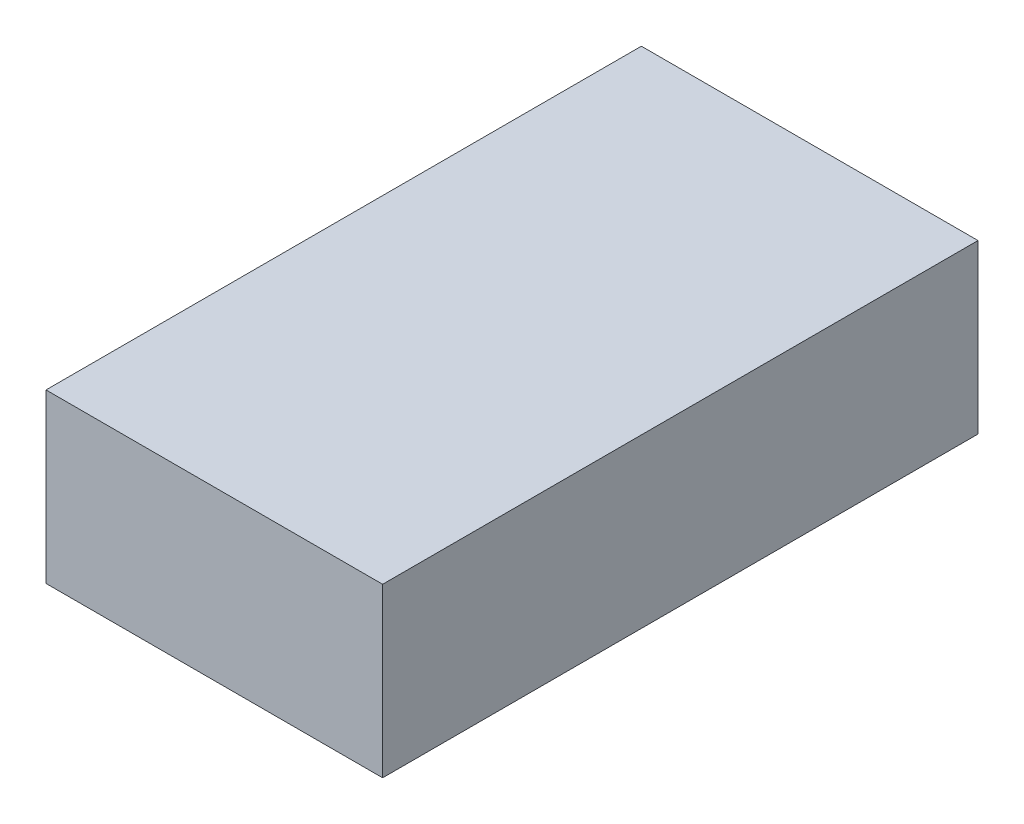
ISO-10303-21;
HEADER;
FILE_DESCRIPTION(('STEP AP214'),'2;1');
FILE_NAME('part.step','',(''),(''),'','','');
FILE_SCHEMA(('AUTOMOTIVE_DESIGN { 1 0 10303 214 1 1 1 1 }'));
ENDSEC;
DATA;
#1=APPLICATION_CONTEXT('core data for automotive mechanical design processes');
#2=APPLICATION_PROTOCOL_DEFINITION('international standard','automotive_design',2000,#1);
#3=PRODUCT_CONTEXT('',#1,'mechanical');
#4=PRODUCT('Part','Part','',(#3));
#5=PRODUCT_RELATED_PRODUCT_CATEGORY('part','',(#4));
#6=PRODUCT_DEFINITION_FORMATION('','',#4);
#7=PRODUCT_DEFINITION_CONTEXT('part definition',#1,'design');
#8=PRODUCT_DEFINITION('design','',#6,#7);
#9=PRODUCT_DEFINITION_SHAPE('','',#8);
#10=(LENGTH_UNIT() NAMED_UNIT(*) SI_UNIT(.MILLI.,.METRE.));
#11=(NAMED_UNIT(*) PLANE_ANGLE_UNIT() SI_UNIT($,.RADIAN.));
#12=(NAMED_UNIT(*) SI_UNIT($,.STERADIAN.) SOLID_ANGLE_UNIT());
#13=UNCERTAINTY_MEASURE_WITH_UNIT(LENGTH_MEASURE(1.E-05),#10,'distance_accuracy_value','');
#14=(GEOMETRIC_REPRESENTATION_CONTEXT(3) GLOBAL_UNCERTAINTY_ASSIGNED_CONTEXT((#13)) GLOBAL_UNIT_ASSIGNED_CONTEXT((#10,
#11,#12)) REPRESENTATION_CONTEXT('',''));
#15=CARTESIAN_POINT('',(0.,0.,0.));
#16=DIRECTION('',(0.,0.,1.));
#17=DIRECTION('',(1.,0.,0.));
#18=AXIS2_PLACEMENT_3D('',#15,#16,#17);
#19=CARTESIAN_POINT('',(0.,91.9289337310978,-536.));
#20=DIRECTION('',(-1.,0.,0.));
#21=DIRECTION('',(0.,0.,1.));
#22=AXIS2_PLACEMENT_3D('',#19,#20,#21);
#23=PLANE('',#22);
#24=DIRECTION('',(0.,-1.,0.));
#25=VECTOR('',#24,1.);
#26=CARTESIAN_POINT('',(0.,91.9289337310978,0.));
#27=LINE('',#26,#25);
#28=CARTESIAN_POINT('',(0.,91.9289337310978,0.));
#29=VERTEX_POINT('',#28);
#30=CARTESIAN_POINT('',(0.,-58.9753023465872,0.));
#31=VERTEX_POINT('',#30);
#32=EDGE_CURVE('E99',#29,#31,#27,.T.);
#33=ORIENTED_EDGE('',*,*,#32,.F.);
#34=DIRECTION('',(0.,0.,1.));
#35=VECTOR('',#34,1.);
#36=CARTESIAN_POINT('',(0.,91.9289337310978,-536.));
#37=LINE('',#36,#35);
#38=CARTESIAN_POINT('',(0.,91.9289337310978,-536.));
#39=VERTEX_POINT('',#38);
#40=EDGE_CURVE('E11',#39,#29,#37,.T.);
#41=ORIENTED_EDGE('',*,*,#40,.F.);
#42=DIRECTION('',(0.,-1.,0.));
#43=VECTOR('',#42,1.);
#44=CARTESIAN_POINT('',(0.,91.9289337310978,-536.));
#45=LINE('',#44,#43);
#46=CARTESIAN_POINT('',(0.,-58.9753023465872,-536.));
#47=VERTEX_POINT('',#46);
#48=EDGE_CURVE('E93',#39,#47,#45,.T.);
#49=ORIENTED_EDGE('',*,*,#48,.T.);
#50=DIRECTION('',(0.,0.,1.));
#51=VECTOR('',#50,1.);
#52=CARTESIAN_POINT('',(0.,-58.9753023465872,-536.));
#53=LINE('',#52,#51);
#54=EDGE_CURVE('E38',#47,#31,#53,.T.);
#55=ORIENTED_EDGE('',*,*,#54,.T.);
#56=EDGE_LOOP('',(#33,#41,#49,#55));
#57=FACE_BOUND('',#56,.T.);
#58=ADVANCED_FACE('F35',(#57),#23,.T.);
#59=CARTESIAN_POINT('',(0.,91.9289337310978,-536.));
#60=DIRECTION('',(0.,1.,0.));
#61=DIRECTION('',(0.,0.,1.));
#62=AXIS2_PLACEMENT_3D('',#59,#60,#61);
#63=PLANE('',#62);
#64=DIRECTION('',(-1.,0.,0.));
#65=VECTOR('',#64,1.);
#66=CARTESIAN_POINT('',(0.,91.9289337310978,0.));
#67=LINE('',#66,#65);
#68=CARTESIAN_POINT('',(303.05553777195,91.9289337310978,0.));
#69=VERTEX_POINT('',#68);
#70=EDGE_CURVE('E95',#69,#29,#67,.T.);
#71=ORIENTED_EDGE('',*,*,#70,.F.);
#72=DIRECTION('',(0.,0.,1.));
#73=VECTOR('',#72,1.);
#74=CARTESIAN_POINT('',(303.05553777195,91.9289337310978,-536.));
#75=LINE('',#74,#73);
#76=CARTESIAN_POINT('',(303.05553777195,91.9289337310978,-536.));
#77=VERTEX_POINT('',#76);
#78=EDGE_CURVE('E44',#77,#69,#75,.T.);
#79=ORIENTED_EDGE('',*,*,#78,.F.);
#80=DIRECTION('',(-1.,0.,0.));
#81=VECTOR('',#80,1.);
#82=CARTESIAN_POINT('',(0.,91.9289337310978,-536.));
#83=LINE('',#82,#81);
#84=EDGE_CURVE('E90',#77,#39,#83,.T.);
#85=ORIENTED_EDGE('',*,*,#84,.T.);
#86=ORIENTED_EDGE('',*,*,#40,.T.);
#87=EDGE_LOOP('',(#71,#79,#85,#86));
#88=FACE_BOUND('',#87,.T.);
#89=ADVANCED_FACE('F109',(#88),#63,.T.);
#90=CARTESIAN_POINT('',(303.05553777195,91.9289337310978,-536.));
#91=DIRECTION('',(1.,0.,0.));
#92=DIRECTION('',(0.,0.,-1.));
#93=AXIS2_PLACEMENT_3D('',#90,#91,#92);
#94=PLANE('',#93);
#95=DIRECTION('',(0.,1.,0.));
#96=VECTOR('',#95,1.);
#97=CARTESIAN_POINT('',(303.05553777195,91.9289337310978,0.));
#98=LINE('',#97,#96);
#99=CARTESIAN_POINT('',(303.05553777195,-58.9753023465872,0.));
#100=VERTEX_POINT('',#99);
#101=EDGE_CURVE('E85',#100,#69,#98,.T.);
#102=ORIENTED_EDGE('',*,*,#101,.F.);
#103=DIRECTION('',(0.,0.,1.));
#104=VECTOR('',#103,1.);
#105=CARTESIAN_POINT('',(303.05553777195,-58.9753023465872,-536.));
#106=LINE('',#105,#104);
#107=CARTESIAN_POINT('',(303.05553777195,-58.9753023465872,-536.));
#108=VERTEX_POINT('',#107);
#109=EDGE_CURVE('E80',#108,#100,#106,.T.);
#110=ORIENTED_EDGE('',*,*,#109,.F.);
#111=DIRECTION('',(0.,1.,0.));
#112=VECTOR('',#111,1.);
#113=CARTESIAN_POINT('',(303.05553777195,91.9289337310978,-536.));
#114=LINE('',#113,#112);
#115=EDGE_CURVE('E83',#108,#77,#114,.T.);
#116=ORIENTED_EDGE('',*,*,#115,.T.);
#117=ORIENTED_EDGE('',*,*,#78,.T.);
#118=EDGE_LOOP('',(#102,#110,#116,#117));
#119=FACE_BOUND('',#118,.T.);
#120=ADVANCED_FACE('F82',(#119),#94,.T.);
#121=CARTESIAN_POINT('',(0.,-58.9753023465872,-536.));
#122=DIRECTION('',(0.,-1.,0.));
#123=DIRECTION('',(0.,0.,-1.));
#124=AXIS2_PLACEMENT_3D('',#121,#122,#123);
#125=PLANE('',#124);
#126=DIRECTION('',(1.,0.,0.));
#127=VECTOR('',#126,1.);
#128=CARTESIAN_POINT('',(0.,-58.9753023465872,0.));
#129=LINE('',#128,#127);
#130=EDGE_CURVE('E102',#31,#100,#129,.T.);
#131=ORIENTED_EDGE('',*,*,#130,.F.);
#132=ORIENTED_EDGE('',*,*,#54,.F.);
#133=DIRECTION('',(1.,0.,0.));
#134=VECTOR('',#133,1.);
#135=CARTESIAN_POINT('',(0.,-58.9753023465872,-536.));
#136=LINE('',#135,#134);
#137=EDGE_CURVE('E89',#47,#108,#136,.T.);
#138=ORIENTED_EDGE('',*,*,#137,.T.);
#139=ORIENTED_EDGE('',*,*,#109,.T.);
#140=EDGE_LOOP('',(#131,#132,#138,#139));
#141=FACE_BOUND('',#140,.T.);
#142=ADVANCED_FACE('F92',(#141),#125,.T.);
#143=CARTESIAN_POINT('',(0.,0.,-536.));
#144=DIRECTION('',(0.,0.,1.));
#145=DIRECTION('',(1.,0.,0.));
#146=AXIS2_PLACEMENT_3D('',#143,#144,#145);
#147=PLANE('',#146);
#148=ORIENTED_EDGE('',*,*,#48,.F.);
#149=ORIENTED_EDGE('',*,*,#84,.F.);
#150=ORIENTED_EDGE('',*,*,#115,.F.);
#151=ORIENTED_EDGE('',*,*,#137,.F.);
#152=EDGE_LOOP('',(#148,#149,#150,#151));
#153=FACE_BOUND('',#152,.T.);
#154=ADVANCED_FACE('F88',(#153),#147,.F.);
#155=CARTESIAN_POINT('',(0.,0.,0.));
#156=DIRECTION('',(0.,0.,1.));
#157=DIRECTION('',(1.,0.,0.));
#158=AXIS2_PLACEMENT_3D('',#155,#156,#157);
#159=PLANE('',#158);
#160=ORIENTED_EDGE('',*,*,#32,.T.);
#161=ORIENTED_EDGE('',*,*,#130,.T.);
#162=ORIENTED_EDGE('',*,*,#101,.T.);
#163=ORIENTED_EDGE('',*,*,#70,.T.);
#164=EDGE_LOOP('',(#160,#161,#162,#163));
#165=FACE_BOUND('',#164,.T.);
#166=ADVANCED_FACE('F108',(#165),#159,.T.);
#167=CLOSED_SHELL('',(#58,#89,#120,#142,#154,#166));
#168=MANIFOLD_SOLID_BREP('B2',#167);
#169=ADVANCED_BREP_SHAPE_REPRESENTATION('',(#18,#168),#14);
#170=SHAPE_DEFINITION_REPRESENTATION(#9,#169);
ENDSEC;
END-ISO-10303-21;
